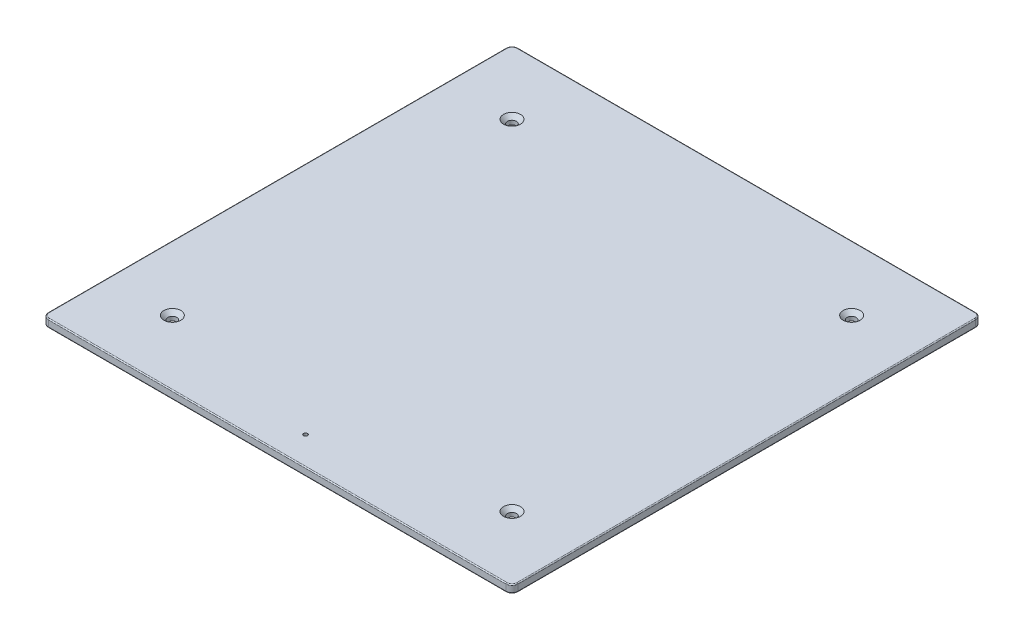
ISO-10303-21;
HEADER;
FILE_DESCRIPTION(('STEP AP214'),'2;1');
FILE_NAME('part.step','',(''),(''),'','','');
FILE_SCHEMA(('AUTOMOTIVE_DESIGN { 1 0 10303 214 1 1 1 1 }'));
ENDSEC;
DATA;
#1=APPLICATION_CONTEXT('core data for automotive mechanical design processes');
#2=APPLICATION_PROTOCOL_DEFINITION('international standard','automotive_design',2000,#1);
#3=PRODUCT_CONTEXT('',#1,'mechanical');
#4=PRODUCT('Part','Part','',(#3));
#5=PRODUCT_RELATED_PRODUCT_CATEGORY('part','',(#4));
#6=PRODUCT_DEFINITION_FORMATION('','',#4);
#7=PRODUCT_DEFINITION_CONTEXT('part definition',#1,'design');
#8=PRODUCT_DEFINITION('design','',#6,#7);
#9=PRODUCT_DEFINITION_SHAPE('','',#8);
#10=(LENGTH_UNIT() NAMED_UNIT(*) SI_UNIT(.MILLI.,.METRE.));
#11=(NAMED_UNIT(*) PLANE_ANGLE_UNIT() SI_UNIT($,.RADIAN.));
#12=(NAMED_UNIT(*) SI_UNIT($,.STERADIAN.) SOLID_ANGLE_UNIT());
#13=UNCERTAINTY_MEASURE_WITH_UNIT(LENGTH_MEASURE(1.E-05),#10,'distance_accuracy_value','');
#14=(GEOMETRIC_REPRESENTATION_CONTEXT(3) GLOBAL_UNCERTAINTY_ASSIGNED_CONTEXT((#13)) GLOBAL_UNIT_ASSIGNED_CONTEXT((#10,
#11,#12)) REPRESENTATION_CONTEXT('',''));
#15=CARTESIAN_POINT('',(0.,0.,0.));
#16=DIRECTION('',(0.,0.,1.));
#17=DIRECTION('',(1.,0.,0.));
#18=AXIS2_PLACEMENT_3D('',#15,#16,#17);
#19=CARTESIAN_POINT('',(0.,4.,0.));
#20=DIRECTION('',(0.,1.,0.));
#21=DIRECTION('',(0.,0.,1.));
#22=AXIS2_PLACEMENT_3D('',#19,#20,#21);
#23=PLANE('',#22);
#24=CARTESIAN_POINT('',(0.,4.,103.332788308511));
#25=DIRECTION('',(0.,1.,0.));
#26=DIRECTION('',(0.,0.,1.));
#27=AXIS2_PLACEMENT_3D('',#24,#25,#26);
#28=CIRCLE('',#27,1.);
#29=CARTESIAN_POINT('',(0.,4.,104.332788308511));
#30=VERTEX_POINT('',#29);
#31=EDGE_CURVE('E886',#30,#30,#28,.T.);
#32=ORIENTED_EDGE('',*,*,#31,.F.);
#33=EDGE_LOOP('',(#32));
#34=FACE_BOUND('',#33,.T.);
#35=DIRECTION('',(-1.,0.,0.));
#36=VECTOR('',#35,1.);
#37=CARTESIAN_POINT('',(-114.5,4.,-117.));
#38=LINE('',#37,#36);
#39=CARTESIAN_POINT('',(114.5,4.,-117.));
#40=VERTEX_POINT('',#39);
#41=CARTESIAN_POINT('',(-114.5,4.,-117.));
#42=VERTEX_POINT('',#41);
#43=EDGE_CURVE('E63',#40,#42,#38,.T.);
#44=ORIENTED_EDGE('',*,*,#43,.T.);
#45=CARTESIAN_POINT('',(-114.5,4.,-114.5));
#46=DIRECTION('',(0.,1.,0.));
#47=DIRECTION('',(0.,0.,1.));
#48=AXIS2_PLACEMENT_3D('',#45,#46,#47);
#49=CIRCLE('',#48,2.5);
#50=CARTESIAN_POINT('',(-117.,4.,-114.5));
#51=VERTEX_POINT('',#50);
#52=EDGE_CURVE('E276',#42,#51,#49,.T.);
#53=ORIENTED_EDGE('',*,*,#52,.T.);
#54=DIRECTION('',(0.,0.,1.));
#55=VECTOR('',#54,1.);
#56=CARTESIAN_POINT('',(-117.,4.,114.5));
#57=LINE('',#56,#55);
#58=CARTESIAN_POINT('',(-117.,4.,114.5));
#59=VERTEX_POINT('',#58);
#60=EDGE_CURVE('E257',#51,#59,#57,.T.);
#61=ORIENTED_EDGE('',*,*,#60,.T.);
#62=CARTESIAN_POINT('',(-114.5,4.,114.5));
#63=DIRECTION('',(0.,1.,0.));
#64=DIRECTION('',(0.,0.,1.));
#65=AXIS2_PLACEMENT_3D('',#62,#63,#64);
#66=CIRCLE('',#65,2.5);
#67=CARTESIAN_POINT('',(-114.5,4.,117.));
#68=VERTEX_POINT('',#67);
#69=EDGE_CURVE('E260',#59,#68,#66,.T.);
#70=ORIENTED_EDGE('',*,*,#69,.T.);
#71=DIRECTION('',(1.,0.,0.));
#72=VECTOR('',#71,1.);
#73=CARTESIAN_POINT('',(114.5,4.,117.));
#74=LINE('',#73,#72);
#75=CARTESIAN_POINT('',(114.5,4.,117.));
#76=VERTEX_POINT('',#75);
#77=EDGE_CURVE('E263',#68,#76,#74,.T.);
#78=ORIENTED_EDGE('',*,*,#77,.T.);
#79=CARTESIAN_POINT('',(114.5,4.,114.5));
#80=DIRECTION('',(0.,1.,0.));
#81=DIRECTION('',(0.,0.,1.));
#82=AXIS2_PLACEMENT_3D('',#79,#80,#81);
#83=CIRCLE('',#82,2.5);
#84=CARTESIAN_POINT('',(117.,4.,114.5));
#85=VERTEX_POINT('',#84);
#86=EDGE_CURVE('E266',#76,#85,#83,.T.);
#87=ORIENTED_EDGE('',*,*,#86,.T.);
#88=DIRECTION('',(0.,0.,-1.));
#89=VECTOR('',#88,1.);
#90=CARTESIAN_POINT('',(117.,4.,-114.5));
#91=LINE('',#90,#89);
#92=CARTESIAN_POINT('',(117.,4.,-114.5));
#93=VERTEX_POINT('',#92);
#94=EDGE_CURVE('E269',#85,#93,#91,.T.);
#95=ORIENTED_EDGE('',*,*,#94,.T.);
#96=CARTESIAN_POINT('',(114.5,4.,-114.5));
#97=DIRECTION('',(0.,1.,0.));
#98=DIRECTION('',(0.,0.,1.));
#99=AXIS2_PLACEMENT_3D('',#96,#97,#98);
#100=CIRCLE('',#99,2.5);
#101=EDGE_CURVE('E68',#93,#40,#100,.T.);
#102=ORIENTED_EDGE('',*,*,#101,.T.);
#103=EDGE_LOOP('',(#44,#53,#61,#70,#78,#87,#95,#102));
#104=FACE_BOUND('',#103,.T.);
#105=CARTESIAN_POINT('',(-85.,4.,85.));
#106=DIRECTION('',(0.,1.,0.));
#107=DIRECTION('',(0.,0.,1.));
#108=AXIS2_PLACEMENT_3D('',#105,#106,#107);
#109=CIRCLE('',#108,4.25);
#110=CARTESIAN_POINT('',(-85.,4.,89.25));
#111=VERTEX_POINT('',#110);
#112=EDGE_CURVE('E842',#111,#111,#109,.F.);
#113=ORIENTED_EDGE('',*,*,#112,.T.);
#114=EDGE_LOOP('',(#113));
#115=FACE_BOUND('',#114,.T.);
#116=CARTESIAN_POINT('',(85.,4.,85.));
#117=DIRECTION('',(0.,1.,0.));
#118=DIRECTION('',(0.,0.,1.));
#119=AXIS2_PLACEMENT_3D('',#116,#117,#118);
#120=CIRCLE('',#119,4.25);
#121=CARTESIAN_POINT('',(85.,4.,89.25));
#122=VERTEX_POINT('',#121);
#123=EDGE_CURVE('E838',#122,#122,#120,.F.);
#124=ORIENTED_EDGE('',*,*,#123,.T.);
#125=EDGE_LOOP('',(#124));
#126=FACE_BOUND('',#125,.T.);
#127=CARTESIAN_POINT('',(85.,4.,-85.));
#128=DIRECTION('',(0.,1.,0.));
#129=DIRECTION('',(0.,0.,1.));
#130=AXIS2_PLACEMENT_3D('',#127,#128,#129);
#131=CIRCLE('',#130,4.24999999999992);
#132=CARTESIAN_POINT('',(85.,4.,-80.75));
#133=VERTEX_POINT('',#132);
#134=EDGE_CURVE('E834',#133,#133,#131,.F.);
#135=ORIENTED_EDGE('',*,*,#134,.T.);
#136=EDGE_LOOP('',(#135));
#137=FACE_BOUND('',#136,.T.);
#138=CARTESIAN_POINT('',(-85.,4.,-85.));
#139=DIRECTION('',(0.,1.,0.));
#140=DIRECTION('',(0.,0.,1.));
#141=AXIS2_PLACEMENT_3D('',#138,#139,#140);
#142=CIRCLE('',#141,4.25000000000009);
#143=CARTESIAN_POINT('',(-85.,4.,-80.7499999999999));
#144=VERTEX_POINT('',#143);
#145=EDGE_CURVE('E824',#144,#144,#142,.F.);
#146=ORIENTED_EDGE('',*,*,#145,.T.);
#147=EDGE_LOOP('',(#146));
#148=FACE_BOUND('',#147,.T.);
#149=ADVANCED_FACE('F45',(#34,#104,#115,#126,#137,#148),#23,.T.);
#150=CARTESIAN_POINT('',(0.,0.,0.));
#151=DIRECTION('',(0.,1.,0.));
#152=DIRECTION('',(0.,0.,1.));
#153=AXIS2_PLACEMENT_3D('',#150,#151,#152);
#154=PLANE('',#153);
#155=CARTESIAN_POINT('',(0.,0.,103.332788308511));
#156=DIRECTION('',(0.,1.,0.));
#157=DIRECTION('',(0.,0.,1.));
#158=AXIS2_PLACEMENT_3D('',#155,#156,#157);
#159=CIRCLE('',#158,1.);
#160=CARTESIAN_POINT('',(0.,0.,104.332788308511));
#161=VERTEX_POINT('',#160);
#162=EDGE_CURVE('E308',#161,#161,#159,.T.);
#163=ORIENTED_EDGE('',*,*,#162,.T.);
#164=EDGE_LOOP('',(#163));
#165=FACE_BOUND('',#164,.T.);
#166=DIRECTION('',(-1.,0.,0.));
#167=VECTOR('',#166,1.);
#168=CARTESIAN_POINT('',(0.,0.,-117.));
#169=LINE('',#168,#167);
#170=CARTESIAN_POINT('',(-114.5,0.,-117.));
#171=VERTEX_POINT('',#170);
#172=CARTESIAN_POINT('',(114.5,0.,-117.));
#173=VERTEX_POINT('',#172);
#174=EDGE_CURVE('E165',#171,#173,#169,.F.);
#175=ORIENTED_EDGE('',*,*,#174,.T.);
#176=CARTESIAN_POINT('',(114.5,0.,-114.5));
#177=DIRECTION('',(0.,1.,0.));
#178=DIRECTION('',(0.,0.,1.));
#179=AXIS2_PLACEMENT_3D('',#176,#177,#178);
#180=CIRCLE('',#179,2.5);
#181=CARTESIAN_POINT('',(117.,0.,-114.5));
#182=VERTEX_POINT('',#181);
#183=EDGE_CURVE('E211',#173,#182,#180,.F.);
#184=ORIENTED_EDGE('',*,*,#183,.T.);
#185=DIRECTION('',(0.,0.,-1.));
#186=VECTOR('',#185,1.);
#187=CARTESIAN_POINT('',(117.,0.,0.));
#188=LINE('',#187,#186);
#189=CARTESIAN_POINT('',(117.,0.,114.5));
#190=VERTEX_POINT('',#189);
#191=EDGE_CURVE('E208',#182,#190,#188,.F.);
#192=ORIENTED_EDGE('',*,*,#191,.T.);
#193=CARTESIAN_POINT('',(114.5,0.,114.5));
#194=DIRECTION('',(0.,1.,0.));
#195=DIRECTION('',(0.,0.,1.));
#196=AXIS2_PLACEMENT_3D('',#193,#194,#195);
#197=CIRCLE('',#196,2.5);
#198=CARTESIAN_POINT('',(114.5,0.,117.));
#199=VERTEX_POINT('',#198);
#200=EDGE_CURVE('E205',#190,#199,#197,.F.);
#201=ORIENTED_EDGE('',*,*,#200,.T.);
#202=DIRECTION('',(1.,0.,0.));
#203=VECTOR('',#202,1.);
#204=CARTESIAN_POINT('',(0.,0.,117.));
#205=LINE('',#204,#203);
#206=CARTESIAN_POINT('',(-114.5,0.,117.));
#207=VERTEX_POINT('',#206);
#208=EDGE_CURVE('E202',#199,#207,#205,.F.);
#209=ORIENTED_EDGE('',*,*,#208,.T.);
#210=CARTESIAN_POINT('',(-114.5,0.,114.5));
#211=DIRECTION('',(0.,1.,0.));
#212=DIRECTION('',(0.,0.,1.));
#213=AXIS2_PLACEMENT_3D('',#210,#211,#212);
#214=CIRCLE('',#213,2.5);
#215=CARTESIAN_POINT('',(-117.,0.,114.5));
#216=VERTEX_POINT('',#215);
#217=EDGE_CURVE('E199',#207,#216,#214,.F.);
#218=ORIENTED_EDGE('',*,*,#217,.T.);
#219=DIRECTION('',(0.,0.,1.));
#220=VECTOR('',#219,1.);
#221=CARTESIAN_POINT('',(-117.,0.,0.));
#222=LINE('',#221,#220);
#223=CARTESIAN_POINT('',(-117.,0.,-114.5));
#224=VERTEX_POINT('',#223);
#225=EDGE_CURVE('E168',#216,#224,#222,.F.);
#226=ORIENTED_EDGE('',*,*,#225,.T.);
#227=CARTESIAN_POINT('',(-114.5,0.,-114.5));
#228=DIRECTION('',(0.,1.,0.));
#229=DIRECTION('',(0.,0.,1.));
#230=AXIS2_PLACEMENT_3D('',#227,#228,#229);
#231=CIRCLE('',#230,2.5);
#232=EDGE_CURVE('E159',#224,#171,#231,.F.);
#233=ORIENTED_EDGE('',*,*,#232,.T.);
#234=EDGE_LOOP('',(#175,#184,#192,#201,#209,#218,#226,#233));
#235=FACE_BOUND('',#234,.T.);
#236=CARTESIAN_POINT('',(85.,0.,-85.));
#237=DIRECTION('',(0.,1.,0.));
#238=DIRECTION('',(0.,0.,1.));
#239=AXIS2_PLACEMENT_3D('',#236,#237,#238);
#240=CIRCLE('',#239,2.25);
#241=CARTESIAN_POINT('',(85.,0.,-82.7499999999999));
#242=VERTEX_POINT('',#241);
#243=EDGE_CURVE('E816',#242,#242,#240,.T.);
#244=ORIENTED_EDGE('',*,*,#243,.T.);
#245=EDGE_LOOP('',(#244));
#246=FACE_BOUND('',#245,.T.);
#247=CARTESIAN_POINT('',(-85.,0.,-85.));
#248=DIRECTION('',(0.,1.,0.));
#249=DIRECTION('',(0.,0.,1.));
#250=AXIS2_PLACEMENT_3D('',#247,#248,#249);
#251=CIRCLE('',#250,2.25);
#252=CARTESIAN_POINT('',(-85.,0.,-82.75));
#253=VERTEX_POINT('',#252);
#254=EDGE_CURVE('E819',#253,#253,#251,.T.);
#255=ORIENTED_EDGE('',*,*,#254,.T.);
#256=EDGE_LOOP('',(#255));
#257=FACE_BOUND('',#256,.T.);
#258=CARTESIAN_POINT('',(-85.,0.,85.));
#259=DIRECTION('',(0.,1.,0.));
#260=DIRECTION('',(0.,0.,1.));
#261=AXIS2_PLACEMENT_3D('',#258,#259,#260);
#262=CIRCLE('',#261,2.25);
#263=CARTESIAN_POINT('',(-85.,0.,87.25));
#264=VERTEX_POINT('',#263);
#265=EDGE_CURVE('E827',#264,#264,#262,.T.);
#266=ORIENTED_EDGE('',*,*,#265,.T.);
#267=EDGE_LOOP('',(#266));
#268=FACE_BOUND('',#267,.T.);
#269=CARTESIAN_POINT('',(85.,0.,85.));
#270=DIRECTION('',(0.,1.,0.));
#271=DIRECTION('',(0.,0.,1.));
#272=AXIS2_PLACEMENT_3D('',#269,#270,#271);
#273=CIRCLE('',#272,2.25);
#274=CARTESIAN_POINT('',(85.,0.,87.25));
#275=VERTEX_POINT('',#274);
#276=EDGE_CURVE('E303',#275,#275,#273,.T.);
#277=ORIENTED_EDGE('',*,*,#276,.T.);
#278=EDGE_LOOP('',(#277));
#279=FACE_BOUND('',#278,.T.);
#280=ADVANCED_FACE('F161',(#165,#235,#246,#257,#268,#279),#154,.F.);
#281=CARTESIAN_POINT('',(117.5,4.,-117.5));
#282=DIRECTION('',(-1.,0.,0.));
#283=DIRECTION('',(0.,0.,1.));
#284=AXIS2_PLACEMENT_3D('',#281,#282,#283);
#285=PLANE('',#284);
#286=DIRECTION('',(0.,-1.,0.));
#287=VECTOR('',#286,1.);
#288=CARTESIAN_POINT('',(117.5,4.,114.5));
#289=LINE('',#288,#287);
#290=CARTESIAN_POINT('',(117.5,3.5,114.5));
#291=VERTEX_POINT('',#290);
#292=CARTESIAN_POINT('',(117.5,0.5,114.5));
#293=VERTEX_POINT('',#292);
#294=EDGE_CURVE('E352',#291,#293,#289,.T.);
#295=ORIENTED_EDGE('',*,*,#294,.T.);
#296=DIRECTION('',(0.,0.,-1.));
#297=VECTOR('',#296,1.);
#298=CARTESIAN_POINT('',(117.5,0.5,-117.5));
#299=LINE('',#298,#297);
#300=CARTESIAN_POINT('',(117.5,0.5,-114.5));
#301=VERTEX_POINT('',#300);
#302=EDGE_CURVE('E224',#293,#301,#299,.T.);
#303=ORIENTED_EDGE('',*,*,#302,.T.);
#304=DIRECTION('',(0.,-1.,0.));
#305=VECTOR('',#304,1.);
#306=CARTESIAN_POINT('',(117.5,4.,-114.5));
#307=LINE('',#306,#305);
#308=CARTESIAN_POINT('',(117.5,3.5,-114.5));
#309=VERTEX_POINT('',#308);
#310=EDGE_CURVE('E856',#301,#309,#307,.F.);
#311=ORIENTED_EDGE('',*,*,#310,.T.);
#312=DIRECTION('',(0.,0.,-1.));
#313=VECTOR('',#312,1.);
#314=CARTESIAN_POINT('',(117.5,3.5,114.5));
#315=LINE('',#314,#313);
#316=EDGE_CURVE('E221',#309,#291,#315,.F.);
#317=ORIENTED_EDGE('',*,*,#316,.T.);
#318=EDGE_LOOP('',(#295,#303,#311,#317));
#319=FACE_BOUND('',#318,.T.);
#320=ADVANCED_FACE('F429',(#319),#285,.F.);
#321=CARTESIAN_POINT('',(-117.5,4.,-117.5));
#322=DIRECTION('',(0.,0.,1.));
#323=DIRECTION('',(1.,0.,0.));
#324=AXIS2_PLACEMENT_3D('',#321,#322,#323);
#325=PLANE('',#324);
#326=DIRECTION('',(0.,-1.,0.));
#327=VECTOR('',#326,1.);
#328=CARTESIAN_POINT('',(-114.5,4.,-117.5));
#329=LINE('',#328,#327);
#330=CARTESIAN_POINT('',(-114.5,0.5,-117.5));
#331=VERTEX_POINT('',#330);
#332=CARTESIAN_POINT('',(-114.5,3.5,-117.5));
#333=VERTEX_POINT('',#332);
#334=EDGE_CURVE('E189',#331,#333,#329,.F.);
#335=ORIENTED_EDGE('',*,*,#334,.T.);
#336=DIRECTION('',(-1.,0.,0.));
#337=VECTOR('',#336,1.);
#338=CARTESIAN_POINT('',(114.5,3.5,-117.5));
#339=LINE('',#338,#337);
#340=CARTESIAN_POINT('',(114.5,3.5,-117.5));
#341=VERTEX_POINT('',#340);
#342=EDGE_CURVE('E11',#333,#341,#339,.F.);
#343=ORIENTED_EDGE('',*,*,#342,.T.);
#344=DIRECTION('',(0.,-1.,0.));
#345=VECTOR('',#344,1.);
#346=CARTESIAN_POINT('',(114.5,4.,-117.5));
#347=LINE('',#346,#345);
#348=CARTESIAN_POINT('',(114.5,0.5,-117.5));
#349=VERTEX_POINT('',#348);
#350=EDGE_CURVE('E193',#341,#349,#347,.T.);
#351=ORIENTED_EDGE('',*,*,#350,.T.);
#352=DIRECTION('',(-1.,0.,0.));
#353=VECTOR('',#352,1.);
#354=CARTESIAN_POINT('',(-117.5,0.5,-117.5));
#355=LINE('',#354,#353);
#356=EDGE_CURVE('E55',#349,#331,#355,.T.);
#357=ORIENTED_EDGE('',*,*,#356,.T.);
#358=EDGE_LOOP('',(#335,#343,#351,#357));
#359=FACE_BOUND('',#358,.T.);
#360=ADVANCED_FACE('F376',(#359),#325,.F.);
#361=CARTESIAN_POINT('',(-117.5,4.,-117.5));
#362=DIRECTION('',(1.,0.,0.));
#363=DIRECTION('',(0.,0.,-1.));
#364=AXIS2_PLACEMENT_3D('',#361,#362,#363);
#365=PLANE('',#364);
#366=DIRECTION('',(0.,-1.,0.));
#367=VECTOR('',#366,1.);
#368=CARTESIAN_POINT('',(-117.5,4.,-114.5));
#369=LINE('',#368,#367);
#370=CARTESIAN_POINT('',(-117.5,3.5,-114.5));
#371=VERTEX_POINT('',#370);
#372=CARTESIAN_POINT('',(-117.5,0.5,-114.5));
#373=VERTEX_POINT('',#372);
#374=EDGE_CURVE('E359',#371,#373,#369,.T.);
#375=ORIENTED_EDGE('',*,*,#374,.T.);
#376=DIRECTION('',(0.,0.,1.));
#377=VECTOR('',#376,1.);
#378=CARTESIAN_POINT('',(-117.5,0.5,-117.5));
#379=LINE('',#378,#377);
#380=CARTESIAN_POINT('',(-117.5,0.5,114.5));
#381=VERTEX_POINT('',#380);
#382=EDGE_CURVE('E248',#373,#381,#379,.T.);
#383=ORIENTED_EDGE('',*,*,#382,.T.);
#384=DIRECTION('',(0.,-1.,0.));
#385=VECTOR('',#384,1.);
#386=CARTESIAN_POINT('',(-117.5,4.,114.5));
#387=LINE('',#386,#385);
#388=CARTESIAN_POINT('',(-117.5,3.5,114.5));
#389=VERTEX_POINT('',#388);
#390=EDGE_CURVE('E365',#381,#389,#387,.F.);
#391=ORIENTED_EDGE('',*,*,#390,.T.);
#392=DIRECTION('',(0.,0.,1.));
#393=VECTOR('',#392,1.);
#394=CARTESIAN_POINT('',(-117.5,3.5,-114.5));
#395=LINE('',#394,#393);
#396=EDGE_CURVE('E245',#389,#371,#395,.F.);
#397=ORIENTED_EDGE('',*,*,#396,.T.);
#398=EDGE_LOOP('',(#375,#383,#391,#397));
#399=FACE_BOUND('',#398,.T.);
#400=ADVANCED_FACE('F407',(#399),#365,.F.);
#401=CARTESIAN_POINT('',(-117.5,4.,117.5));
#402=DIRECTION('',(0.,0.,-1.));
#403=DIRECTION('',(-1.,0.,0.));
#404=AXIS2_PLACEMENT_3D('',#401,#402,#403);
#405=PLANE('',#404);
#406=DIRECTION('',(0.,-1.,0.));
#407=VECTOR('',#406,1.);
#408=CARTESIAN_POINT('',(-114.5,4.,117.5));
#409=LINE('',#408,#407);
#410=CARTESIAN_POINT('',(-114.5,3.5,117.5));
#411=VERTEX_POINT('',#410);
#412=CARTESIAN_POINT('',(-114.5,0.5,117.5));
#413=VERTEX_POINT('',#412);
#414=EDGE_CURVE('E360',#411,#413,#409,.T.);
#415=ORIENTED_EDGE('',*,*,#414,.T.);
#416=DIRECTION('',(1.,0.,0.));
#417=VECTOR('',#416,1.);
#418=CARTESIAN_POINT('',(-117.5,0.5,117.5));
#419=LINE('',#418,#417);
#420=CARTESIAN_POINT('',(114.5,0.5,117.5));
#421=VERTEX_POINT('',#420);
#422=EDGE_CURVE('E236',#413,#421,#419,.T.);
#423=ORIENTED_EDGE('',*,*,#422,.T.);
#424=DIRECTION('',(0.,-1.,0.));
#425=VECTOR('',#424,1.);
#426=CARTESIAN_POINT('',(114.5,4.,117.5));
#427=LINE('',#426,#425);
#428=CARTESIAN_POINT('',(114.5,3.5,117.5));
#429=VERTEX_POINT('',#428);
#430=EDGE_CURVE('E349',#421,#429,#427,.F.);
#431=ORIENTED_EDGE('',*,*,#430,.T.);
#432=DIRECTION('',(1.,0.,0.));
#433=VECTOR('',#432,1.);
#434=CARTESIAN_POINT('',(-114.5,3.5,117.5));
#435=LINE('',#434,#433);
#436=EDGE_CURVE('E233',#429,#411,#435,.F.);
#437=ORIENTED_EDGE('',*,*,#436,.T.);
#438=EDGE_LOOP('',(#415,#423,#431,#437));
#439=FACE_BOUND('',#438,.T.);
#440=ADVANCED_FACE('F355',(#439),#405,.F.);
#441=CARTESIAN_POINT('',(85.,4.,-85.));
#442=DIRECTION('',(0.,-1.,0.));
#443=DIRECTION('',(0.,0.,-1.));
#444=AXIS2_PLACEMENT_3D('',#441,#442,#443);
#445=CYLINDRICAL_SURFACE('',#444,2.25);
#446=CARTESIAN_POINT('',(85.,2.0000000000001,-85.));
#447=DIRECTION('',(0.,1.,0.));
#448=DIRECTION('',(0.,0.,1.));
#449=AXIS2_PLACEMENT_3D('',#446,#447,#448);
#450=CIRCLE('',#449,2.25);
#451=CARTESIAN_POINT('',(85.,2.0000000000001,-82.7499999999999));
#452=VERTEX_POINT('',#451);
#453=EDGE_CURVE('E813',#452,#452,#450,.T.);
#454=ORIENTED_EDGE('',*,*,#453,.T.);
#455=EDGE_LOOP('',(#454));
#456=FACE_BOUND('',#455,.T.);
#457=ORIENTED_EDGE('',*,*,#243,.F.);
#458=EDGE_LOOP('',(#457));
#459=FACE_BOUND('',#458,.T.);
#460=ADVANCED_FACE('F434',(#456,#459),#445,.F.);
#461=CARTESIAN_POINT('',(-85.,4.,-85.));
#462=DIRECTION('',(0.,-1.,0.));
#463=DIRECTION('',(0.,0.,-1.));
#464=AXIS2_PLACEMENT_3D('',#461,#462,#463);
#465=CYLINDRICAL_SURFACE('',#464,2.25);
#466=CARTESIAN_POINT('',(-85.,1.99999999999993,-85.));
#467=DIRECTION('',(0.,1.,0.));
#468=DIRECTION('',(0.,0.,1.));
#469=AXIS2_PLACEMENT_3D('',#466,#467,#468);
#470=CIRCLE('',#469,2.25);
#471=CARTESIAN_POINT('',(-85.,1.99999999999993,-82.75));
#472=VERTEX_POINT('',#471);
#473=EDGE_CURVE('E852',#472,#472,#470,.T.);
#474=ORIENTED_EDGE('',*,*,#473,.T.);
#475=EDGE_LOOP('',(#474));
#476=FACE_BOUND('',#475,.T.);
#477=ORIENTED_EDGE('',*,*,#254,.F.);
#478=EDGE_LOOP('',(#477));
#479=FACE_BOUND('',#478,.T.);
#480=ADVANCED_FACE('F742',(#476,#479),#465,.F.);
#481=CARTESIAN_POINT('',(-85.,4.,85.));
#482=DIRECTION('',(0.,-1.,0.));
#483=DIRECTION('',(0.,0.,-1.));
#484=AXIS2_PLACEMENT_3D('',#481,#482,#483);
#485=CYLINDRICAL_SURFACE('',#484,2.25);
#486=CARTESIAN_POINT('',(-85.,2.00000000000001,85.));
#487=DIRECTION('',(0.,1.,0.));
#488=DIRECTION('',(0.,0.,1.));
#489=AXIS2_PLACEMENT_3D('',#486,#487,#488);
#490=CIRCLE('',#489,2.25);
#491=CARTESIAN_POINT('',(-85.,2.00000000000001,87.25));
#492=VERTEX_POINT('',#491);
#493=EDGE_CURVE('E818',#492,#492,#490,.T.);
#494=ORIENTED_EDGE('',*,*,#493,.T.);
#495=EDGE_LOOP('',(#494));
#496=FACE_BOUND('',#495,.T.);
#497=ORIENTED_EDGE('',*,*,#265,.F.);
#498=EDGE_LOOP('',(#497));
#499=FACE_BOUND('',#498,.T.);
#500=ADVANCED_FACE('F732',(#496,#499),#485,.F.);
#501=CARTESIAN_POINT('',(85.,4.,85.));
#502=DIRECTION('',(0.,-1.,0.));
#503=DIRECTION('',(0.,0.,-1.));
#504=AXIS2_PLACEMENT_3D('',#501,#502,#503);
#505=CYLINDRICAL_SURFACE('',#504,2.25);
#506=CARTESIAN_POINT('',(85.,2.00000000000001,85.));
#507=DIRECTION('',(0.,1.,0.));
#508=DIRECTION('',(0.,0.,1.));
#509=AXIS2_PLACEMENT_3D('',#506,#507,#508);
#510=CIRCLE('',#509,2.25);
#511=CARTESIAN_POINT('',(85.,2.00000000000001,87.25));
#512=VERTEX_POINT('',#511);
#513=EDGE_CURVE('E846',#512,#512,#510,.T.);
#514=ORIENTED_EDGE('',*,*,#513,.T.);
#515=EDGE_LOOP('',(#514));
#516=FACE_BOUND('',#515,.T.);
#517=ORIENTED_EDGE('',*,*,#276,.F.);
#518=EDGE_LOOP('',(#517));
#519=FACE_BOUND('',#518,.T.);
#520=ADVANCED_FACE('F454',(#516,#519),#505,.F.);
#521=CARTESIAN_POINT('',(-85.,2.00000000000001,85.));
#522=DIRECTION('',(0.,1.,0.));
#523=DIRECTION('',(0.,0.,1.));
#524=AXIS2_PLACEMENT_3D('',#521,#522,#523);
#525=CONICAL_SURFACE('',#524,2.25,0.785398163397453);
#526=ORIENTED_EDGE('',*,*,#112,.F.);
#527=EDGE_LOOP('',(#526));
#528=FACE_BOUND('',#527,.T.);
#529=ORIENTED_EDGE('',*,*,#493,.F.);
#530=EDGE_LOOP('',(#529));
#531=FACE_BOUND('',#530,.T.);
#532=ADVANCED_FACE('F447',(#528,#531),#525,.F.);
#533=CARTESIAN_POINT('',(85.,2.00000000000001,85.));
#534=DIRECTION('',(0.,1.,0.));
#535=DIRECTION('',(0.,0.,1.));
#536=AXIS2_PLACEMENT_3D('',#533,#534,#535);
#537=CONICAL_SURFACE('',#536,2.25,0.785398163397453);
#538=ORIENTED_EDGE('',*,*,#123,.F.);
#539=EDGE_LOOP('',(#538));
#540=FACE_BOUND('',#539,.T.);
#541=ORIENTED_EDGE('',*,*,#513,.F.);
#542=EDGE_LOOP('',(#541));
#543=FACE_BOUND('',#542,.T.);
#544=ADVANCED_FACE('F453',(#540,#543),#537,.F.);
#545=CARTESIAN_POINT('',(85.,2.0000000000001,-85.));
#546=DIRECTION('',(0.,1.,0.));
#547=DIRECTION('',(0.,0.,1.));
#548=AXIS2_PLACEMENT_3D('',#545,#546,#547);
#549=CONICAL_SURFACE('',#548,2.25,0.785398163397453);
#550=ORIENTED_EDGE('',*,*,#134,.F.);
#551=EDGE_LOOP('',(#550));
#552=FACE_BOUND('',#551,.T.);
#553=ORIENTED_EDGE('',*,*,#453,.F.);
#554=EDGE_LOOP('',(#553));
#555=FACE_BOUND('',#554,.T.);
#556=ADVANCED_FACE('F461',(#552,#555),#549,.F.);
#557=CARTESIAN_POINT('',(-85.,1.99999999999993,-85.));
#558=DIRECTION('',(0.,1.,0.));
#559=DIRECTION('',(0.,0.,1.));
#560=AXIS2_PLACEMENT_3D('',#557,#558,#559);
#561=CONICAL_SURFACE('',#560,2.25,0.785398163397453);
#562=ORIENTED_EDGE('',*,*,#145,.F.);
#563=EDGE_LOOP('',(#562));
#564=FACE_BOUND('',#563,.T.);
#565=ORIENTED_EDGE('',*,*,#473,.F.);
#566=EDGE_LOOP('',(#565));
#567=FACE_BOUND('',#566,.T.);
#568=ADVANCED_FACE('F468',(#564,#567),#561,.F.);
#569=CARTESIAN_POINT('',(114.5,4.,114.5));
#570=DIRECTION('',(0.,-1.,0.));
#571=DIRECTION('',(0.,0.,-1.));
#572=AXIS2_PLACEMENT_3D('',#569,#570,#571);
#573=CYLINDRICAL_SURFACE('',#572,3.);
#574=ORIENTED_EDGE('',*,*,#430,.F.);
#575=CARTESIAN_POINT('',(114.5,0.5,114.5));
#576=DIRECTION('',(0.,1.,0.));
#577=DIRECTION('',(0.,0.,1.));
#578=AXIS2_PLACEMENT_3D('',#575,#576,#577);
#579=CIRCLE('',#578,3.);
#580=EDGE_CURVE('E230',#421,#293,#579,.T.);
#581=ORIENTED_EDGE('',*,*,#580,.T.);
#582=ORIENTED_EDGE('',*,*,#294,.F.);
#583=CARTESIAN_POINT('',(114.5,3.5,114.5));
#584=DIRECTION('',(0.,1.,0.));
#585=DIRECTION('',(0.,0.,1.));
#586=AXIS2_PLACEMENT_3D('',#583,#584,#585);
#587=CIRCLE('',#586,3.);
#588=EDGE_CURVE('E227',#291,#429,#587,.F.);
#589=ORIENTED_EDGE('',*,*,#588,.T.);
#590=EDGE_LOOP('',(#574,#581,#582,#589));
#591=FACE_BOUND('',#590,.T.);
#592=ADVANCED_FACE('F348',(#591),#573,.T.);
#593=CARTESIAN_POINT('',(-114.5,4.,114.5));
#594=DIRECTION('',(0.,-1.,0.));
#595=DIRECTION('',(0.,0.,-1.));
#596=AXIS2_PLACEMENT_3D('',#593,#594,#595);
#597=CYLINDRICAL_SURFACE('',#596,3.);
#598=ORIENTED_EDGE('',*,*,#390,.F.);
#599=CARTESIAN_POINT('',(-114.5,0.5,114.5));
#600=DIRECTION('',(0.,1.,0.));
#601=DIRECTION('',(0.,0.,1.));
#602=AXIS2_PLACEMENT_3D('',#599,#600,#601);
#603=CIRCLE('',#602,3.);
#604=EDGE_CURVE('E242',#381,#413,#603,.T.);
#605=ORIENTED_EDGE('',*,*,#604,.T.);
#606=ORIENTED_EDGE('',*,*,#414,.F.);
#607=CARTESIAN_POINT('',(-114.5,3.5,114.5));
#608=DIRECTION('',(0.,1.,0.));
#609=DIRECTION('',(0.,0.,1.));
#610=AXIS2_PLACEMENT_3D('',#607,#608,#609);
#611=CIRCLE('',#610,3.);
#612=EDGE_CURVE('E239',#411,#389,#611,.F.);
#613=ORIENTED_EDGE('',*,*,#612,.T.);
#614=EDGE_LOOP('',(#598,#605,#606,#613));
#615=FACE_BOUND('',#614,.T.);
#616=ADVANCED_FACE('F413',(#615),#597,.T.);
#617=CARTESIAN_POINT('',(-114.5,4.,-114.5));
#618=DIRECTION('',(0.,-1.,0.));
#619=DIRECTION('',(0.,0.,-1.));
#620=AXIS2_PLACEMENT_3D('',#617,#618,#619);
#621=CYLINDRICAL_SURFACE('',#620,3.);
#622=ORIENTED_EDGE('',*,*,#334,.F.);
#623=CARTESIAN_POINT('',(-114.5,0.5,-114.5));
#624=DIRECTION('',(0.,1.,0.));
#625=DIRECTION('',(0.,0.,1.));
#626=AXIS2_PLACEMENT_3D('',#623,#624,#625);
#627=CIRCLE('',#626,3.);
#628=EDGE_CURVE('E178',#331,#373,#627,.T.);
#629=ORIENTED_EDGE('',*,*,#628,.T.);
#630=ORIENTED_EDGE('',*,*,#374,.F.);
#631=CARTESIAN_POINT('',(-114.5,3.5,-114.5));
#632=DIRECTION('',(0.,1.,0.));
#633=DIRECTION('',(0.,0.,1.));
#634=AXIS2_PLACEMENT_3D('',#631,#632,#633);
#635=CIRCLE('',#634,3.);
#636=EDGE_CURVE('E251',#371,#333,#635,.F.);
#637=ORIENTED_EDGE('',*,*,#636,.T.);
#638=EDGE_LOOP('',(#622,#629,#630,#637));
#639=FACE_BOUND('',#638,.T.);
#640=ADVANCED_FACE('F411',(#639),#621,.T.);
#641=CARTESIAN_POINT('',(114.5,4.,-114.5));
#642=DIRECTION('',(0.,-1.,0.));
#643=DIRECTION('',(0.,0.,-1.));
#644=AXIS2_PLACEMENT_3D('',#641,#642,#643);
#645=CYLINDRICAL_SURFACE('',#644,3.);
#646=ORIENTED_EDGE('',*,*,#310,.F.);
#647=CARTESIAN_POINT('',(114.5,0.5,-114.5));
#648=DIRECTION('',(0.,1.,0.));
#649=DIRECTION('',(0.,0.,1.));
#650=AXIS2_PLACEMENT_3D('',#647,#648,#649);
#651=CIRCLE('',#650,3.);
#652=EDGE_CURVE('E217',#301,#349,#651,.T.);
#653=ORIENTED_EDGE('',*,*,#652,.T.);
#654=ORIENTED_EDGE('',*,*,#350,.F.);
#655=CARTESIAN_POINT('',(114.5,3.5,-114.5));
#656=DIRECTION('',(0.,1.,0.));
#657=DIRECTION('',(0.,0.,1.));
#658=AXIS2_PLACEMENT_3D('',#655,#656,#657);
#659=CIRCLE('',#658,3.);
#660=EDGE_CURVE('E214',#341,#309,#659,.F.);
#661=ORIENTED_EDGE('',*,*,#660,.T.);
#662=EDGE_LOOP('',(#646,#653,#654,#661));
#663=FACE_BOUND('',#662,.T.);
#664=ADVANCED_FACE('F382',(#663),#645,.T.);
#665=CARTESIAN_POINT('',(-114.5,0.5,114.5));
#666=DIRECTION('',(0.,1.,0.));
#667=DIRECTION('',(0.,0.,1.));
#668=AXIS2_PLACEMENT_3D('',#665,#666,#667);
#669=TOROIDAL_SURFACE('',#668,2.5,0.5);
#670=CARTESIAN_POINT('',(-114.5,0.5,117.));
#671=DIRECTION('',(1.,0.,0.));
#672=DIRECTION('',(0.,0.,-1.));
#673=AXIS2_PLACEMENT_3D('',#670,#671,#672);
#674=CIRCLE('',#673,0.5);
#675=EDGE_CURVE('E295',#413,#207,#674,.T.);
#676=ORIENTED_EDGE('',*,*,#675,.F.);
#677=ORIENTED_EDGE('',*,*,#604,.F.);
#678=CARTESIAN_POINT('',(-117.,0.5,114.5));
#679=DIRECTION('',(0.,0.,-1.));
#680=DIRECTION('',(-1.,0.,0.));
#681=AXIS2_PLACEMENT_3D('',#678,#679,#680);
#682=CIRCLE('',#681,0.5);
#683=EDGE_CURVE('E299',#216,#381,#682,.T.);
#684=ORIENTED_EDGE('',*,*,#683,.F.);
#685=ORIENTED_EDGE('',*,*,#217,.F.);
#686=EDGE_LOOP('',(#676,#677,#684,#685));
#687=FACE_BOUND('',#686,.T.);
#688=ADVANCED_FACE('F419',(#687),#669,.T.);
#689=CARTESIAN_POINT('',(-117.,0.5,-117.5));
#690=DIRECTION('',(0.,0.,1.));
#691=DIRECTION('',(1.,0.,0.));
#692=AXIS2_PLACEMENT_3D('',#689,#690,#691);
#693=CYLINDRICAL_SURFACE('',#692,0.5);
#694=ORIENTED_EDGE('',*,*,#683,.T.);
#695=ORIENTED_EDGE('',*,*,#382,.F.);
#696=CARTESIAN_POINT('',(-117.,0.5,-114.5));
#697=DIRECTION('',(0.,0.,-1.));
#698=DIRECTION('',(-1.,0.,0.));
#699=AXIS2_PLACEMENT_3D('',#696,#697,#698);
#700=CIRCLE('',#699,0.5);
#701=EDGE_CURVE('E292',#224,#373,#700,.T.);
#702=ORIENTED_EDGE('',*,*,#701,.F.);
#703=ORIENTED_EDGE('',*,*,#225,.F.);
#704=EDGE_LOOP('',(#694,#695,#702,#703));
#705=FACE_BOUND('',#704,.T.);
#706=ADVANCED_FACE('F507',(#705),#693,.T.);
#707=CARTESIAN_POINT('',(-117.5,0.5,117.));
#708=DIRECTION('',(1.,0.,0.));
#709=DIRECTION('',(0.,0.,-1.));
#710=AXIS2_PLACEMENT_3D('',#707,#708,#709);
#711=CYLINDRICAL_SURFACE('',#710,0.5);
#712=ORIENTED_EDGE('',*,*,#675,.T.);
#713=ORIENTED_EDGE('',*,*,#208,.F.);
#714=CARTESIAN_POINT('',(114.5,0.5,117.));
#715=DIRECTION('',(1.,0.,0.));
#716=DIRECTION('',(0.,0.,-1.));
#717=AXIS2_PLACEMENT_3D('',#714,#715,#716);
#718=CIRCLE('',#717,0.5);
#719=EDGE_CURVE('E182',#421,#199,#718,.T.);
#720=ORIENTED_EDGE('',*,*,#719,.F.);
#721=ORIENTED_EDGE('',*,*,#422,.F.);
#722=EDGE_LOOP('',(#712,#713,#720,#721));
#723=FACE_BOUND('',#722,.T.);
#724=ADVANCED_FACE('F518',(#723),#711,.T.);
#725=CARTESIAN_POINT('',(-114.5,0.5,-114.5));
#726=DIRECTION('',(0.,1.,0.));
#727=DIRECTION('',(0.,0.,1.));
#728=AXIS2_PLACEMENT_3D('',#725,#726,#727);
#729=TOROIDAL_SURFACE('',#728,2.5,0.5);
#730=ORIENTED_EDGE('',*,*,#701,.T.);
#731=ORIENTED_EDGE('',*,*,#628,.F.);
#732=CARTESIAN_POINT('',(-114.5,0.5,-117.));
#733=DIRECTION('',(1.,0.,0.));
#734=DIRECTION('',(0.,0.,-1.));
#735=AXIS2_PLACEMENT_3D('',#732,#733,#734);
#736=CIRCLE('',#735,0.5);
#737=EDGE_CURVE('E176',#171,#331,#736,.T.);
#738=ORIENTED_EDGE('',*,*,#737,.F.);
#739=ORIENTED_EDGE('',*,*,#232,.F.);
#740=EDGE_LOOP('',(#730,#731,#738,#739));
#741=FACE_BOUND('',#740,.T.);
#742=ADVANCED_FACE('F177',(#741),#729,.T.);
#743=CARTESIAN_POINT('',(114.5,0.5,114.5));
#744=DIRECTION('',(0.,1.,0.));
#745=DIRECTION('',(0.,0.,1.));
#746=AXIS2_PLACEMENT_3D('',#743,#744,#745);
#747=TOROIDAL_SURFACE('',#746,2.5,0.5);
#748=ORIENTED_EDGE('',*,*,#719,.T.);
#749=ORIENTED_EDGE('',*,*,#200,.F.);
#750=CARTESIAN_POINT('',(117.,0.5,114.5));
#751=DIRECTION('',(0.,0.,-1.));
#752=DIRECTION('',(-1.,0.,0.));
#753=AXIS2_PLACEMENT_3D('',#750,#751,#752);
#754=CIRCLE('',#753,0.5);
#755=EDGE_CURVE('E183',#293,#190,#754,.T.);
#756=ORIENTED_EDGE('',*,*,#755,.F.);
#757=ORIENTED_EDGE('',*,*,#580,.F.);
#758=EDGE_LOOP('',(#748,#749,#756,#757));
#759=FACE_BOUND('',#758,.T.);
#760=ADVANCED_FACE('F539',(#759),#747,.T.);
#761=CARTESIAN_POINT('',(-117.5,0.5,-117.));
#762=DIRECTION('',(-1.,0.,0.));
#763=DIRECTION('',(0.,0.,1.));
#764=AXIS2_PLACEMENT_3D('',#761,#762,#763);
#765=CYLINDRICAL_SURFACE('',#764,0.5);
#766=ORIENTED_EDGE('',*,*,#737,.T.);
#767=ORIENTED_EDGE('',*,*,#356,.F.);
#768=CARTESIAN_POINT('',(114.5,0.5,-117.));
#769=DIRECTION('',(1.,0.,0.));
#770=DIRECTION('',(0.,0.,-1.));
#771=AXIS2_PLACEMENT_3D('',#768,#769,#770);
#772=CIRCLE('',#771,0.5);
#773=EDGE_CURVE('E186',#173,#349,#772,.T.);
#774=ORIENTED_EDGE('',*,*,#773,.F.);
#775=ORIENTED_EDGE('',*,*,#174,.F.);
#776=EDGE_LOOP('',(#766,#767,#774,#775));
#777=FACE_BOUND('',#776,.T.);
#778=ADVANCED_FACE('F185',(#777),#765,.T.);
#779=CARTESIAN_POINT('',(117.,0.5,-117.5));
#780=DIRECTION('',(0.,0.,-1.));
#781=DIRECTION('',(-1.,0.,0.));
#782=AXIS2_PLACEMENT_3D('',#779,#780,#781);
#783=CYLINDRICAL_SURFACE('',#782,0.5);
#784=ORIENTED_EDGE('',*,*,#755,.T.);
#785=ORIENTED_EDGE('',*,*,#191,.F.);
#786=CARTESIAN_POINT('',(117.,0.5,-114.5));
#787=DIRECTION('',(0.,0.,-1.));
#788=DIRECTION('',(-1.,0.,0.));
#789=AXIS2_PLACEMENT_3D('',#786,#787,#788);
#790=CIRCLE('',#789,0.5);
#791=EDGE_CURVE('E281',#301,#182,#790,.T.);
#792=ORIENTED_EDGE('',*,*,#791,.F.);
#793=ORIENTED_EDGE('',*,*,#302,.F.);
#794=EDGE_LOOP('',(#784,#785,#792,#793));
#795=FACE_BOUND('',#794,.T.);
#796=ADVANCED_FACE('F559',(#795),#783,.T.);
#797=CARTESIAN_POINT('',(114.5,0.5,-114.5));
#798=DIRECTION('',(0.,1.,0.));
#799=DIRECTION('',(0.,0.,1.));
#800=AXIS2_PLACEMENT_3D('',#797,#798,#799);
#801=TOROIDAL_SURFACE('',#800,2.5,0.5);
#802=ORIENTED_EDGE('',*,*,#773,.T.);
#803=ORIENTED_EDGE('',*,*,#652,.F.);
#804=ORIENTED_EDGE('',*,*,#791,.T.);
#805=ORIENTED_EDGE('',*,*,#183,.F.);
#806=EDGE_LOOP('',(#802,#803,#804,#805));
#807=FACE_BOUND('',#806,.T.);
#808=ADVANCED_FACE('F569',(#807),#801,.T.);
#809=CARTESIAN_POINT('',(114.5,3.5,114.5));
#810=DIRECTION('',(0.,1.,0.));
#811=DIRECTION('',(0.,0.,1.));
#812=AXIS2_PLACEMENT_3D('',#809,#810,#811);
#813=TOROIDAL_SURFACE('',#812,2.5,0.5);
#814=CARTESIAN_POINT('',(114.5,3.5,117.));
#815=DIRECTION('',(-1.,0.,0.));
#816=DIRECTION('',(0.,0.,1.));
#817=AXIS2_PLACEMENT_3D('',#814,#815,#816);
#818=CIRCLE('',#817,0.5);
#819=EDGE_CURVE('E326',#429,#76,#818,.T.);
#820=ORIENTED_EDGE('',*,*,#819,.F.);
#821=ORIENTED_EDGE('',*,*,#588,.F.);
#822=CARTESIAN_POINT('',(117.,3.5,114.5));
#823=DIRECTION('',(0.,0.,-1.));
#824=DIRECTION('',(-1.,0.,0.));
#825=AXIS2_PLACEMENT_3D('',#822,#823,#824);
#826=CIRCLE('',#825,0.5);
#827=EDGE_CURVE('E49',#85,#291,#826,.T.);
#828=ORIENTED_EDGE('',*,*,#827,.F.);
#829=ORIENTED_EDGE('',*,*,#86,.F.);
#830=EDGE_LOOP('',(#820,#821,#828,#829));
#831=FACE_BOUND('',#830,.T.);
#832=ADVANCED_FACE('F47',(#831),#813,.T.);
#833=CARTESIAN_POINT('',(117.,3.5,0.));
#834=DIRECTION('',(0.,0.,1.));
#835=DIRECTION('',(1.,0.,0.));
#836=AXIS2_PLACEMENT_3D('',#833,#834,#835);
#837=CYLINDRICAL_SURFACE('',#836,0.5);
#838=ORIENTED_EDGE('',*,*,#827,.T.);
#839=ORIENTED_EDGE('',*,*,#316,.F.);
#840=CARTESIAN_POINT('',(117.,3.5,-114.5));
#841=DIRECTION('',(0.,0.,-1.));
#842=DIRECTION('',(-1.,0.,0.));
#843=AXIS2_PLACEMENT_3D('',#840,#841,#842);
#844=CIRCLE('',#843,0.5);
#845=EDGE_CURVE('E323',#93,#309,#844,.T.);
#846=ORIENTED_EDGE('',*,*,#845,.F.);
#847=ORIENTED_EDGE('',*,*,#94,.F.);
#848=EDGE_LOOP('',(#838,#839,#846,#847));
#849=FACE_BOUND('',#848,.T.);
#850=ADVANCED_FACE('F339',(#849),#837,.T.);
#851=CARTESIAN_POINT('',(0.,3.5,117.));
#852=DIRECTION('',(-1.,0.,0.));
#853=DIRECTION('',(0.,0.,1.));
#854=AXIS2_PLACEMENT_3D('',#851,#852,#853);
#855=CYLINDRICAL_SURFACE('',#854,0.5);
#856=ORIENTED_EDGE('',*,*,#819,.T.);
#857=ORIENTED_EDGE('',*,*,#77,.F.);
#858=CARTESIAN_POINT('',(-114.5,3.5,117.));
#859=DIRECTION('',(-1.,0.,0.));
#860=DIRECTION('',(0.,0.,1.));
#861=AXIS2_PLACEMENT_3D('',#858,#859,#860);
#862=CIRCLE('',#861,0.5);
#863=EDGE_CURVE('E319',#411,#68,#862,.T.);
#864=ORIENTED_EDGE('',*,*,#863,.F.);
#865=ORIENTED_EDGE('',*,*,#436,.F.);
#866=EDGE_LOOP('',(#856,#857,#864,#865));
#867=FACE_BOUND('',#866,.T.);
#868=ADVANCED_FACE('F598',(#867),#855,.T.);
#869=CARTESIAN_POINT('',(114.5,3.5,-114.5));
#870=DIRECTION('',(0.,1.,0.));
#871=DIRECTION('',(0.,0.,1.));
#872=AXIS2_PLACEMENT_3D('',#869,#870,#871);
#873=TOROIDAL_SURFACE('',#872,2.5,0.5);
#874=ORIENTED_EDGE('',*,*,#845,.T.);
#875=ORIENTED_EDGE('',*,*,#660,.F.);
#876=CARTESIAN_POINT('',(114.5,3.5,-117.));
#877=DIRECTION('',(-1.,0.,0.));
#878=DIRECTION('',(0.,0.,1.));
#879=AXIS2_PLACEMENT_3D('',#876,#877,#878);
#880=CIRCLE('',#879,0.5);
#881=EDGE_CURVE('E315',#40,#341,#880,.T.);
#882=ORIENTED_EDGE('',*,*,#881,.F.);
#883=ORIENTED_EDGE('',*,*,#101,.F.);
#884=EDGE_LOOP('',(#874,#875,#882,#883));
#885=FACE_BOUND('',#884,.T.);
#886=ADVANCED_FACE('F386',(#885),#873,.T.);
#887=CARTESIAN_POINT('',(-114.5,3.5,114.5));
#888=DIRECTION('',(0.,1.,0.));
#889=DIRECTION('',(0.,0.,1.));
#890=AXIS2_PLACEMENT_3D('',#887,#888,#889);
#891=TOROIDAL_SURFACE('',#890,2.5,0.5);
#892=ORIENTED_EDGE('',*,*,#863,.T.);
#893=ORIENTED_EDGE('',*,*,#69,.F.);
#894=CARTESIAN_POINT('',(-117.,3.5,114.5));
#895=DIRECTION('',(0.,0.,-1.));
#896=DIRECTION('',(-1.,0.,0.));
#897=AXIS2_PLACEMENT_3D('',#894,#895,#896);
#898=CIRCLE('',#897,0.5);
#899=EDGE_CURVE('E311',#389,#59,#898,.T.);
#900=ORIENTED_EDGE('',*,*,#899,.F.);
#901=ORIENTED_EDGE('',*,*,#612,.F.);
#902=EDGE_LOOP('',(#892,#893,#900,#901));
#903=FACE_BOUND('',#902,.T.);
#904=ADVANCED_FACE('F400',(#903),#891,.T.);
#905=CARTESIAN_POINT('',(0.,3.5,-117.));
#906=DIRECTION('',(1.,0.,0.));
#907=DIRECTION('',(0.,0.,-1.));
#908=AXIS2_PLACEMENT_3D('',#905,#906,#907);
#909=CYLINDRICAL_SURFACE('',#908,0.5);
#910=ORIENTED_EDGE('',*,*,#881,.T.);
#911=ORIENTED_EDGE('',*,*,#342,.F.);
#912=CARTESIAN_POINT('',(-114.5,3.5,-117.));
#913=DIRECTION('',(-1.,0.,0.));
#914=DIRECTION('',(0.,0.,1.));
#915=AXIS2_PLACEMENT_3D('',#912,#913,#914);
#916=CIRCLE('',#915,0.5);
#917=EDGE_CURVE('E307',#42,#333,#916,.T.);
#918=ORIENTED_EDGE('',*,*,#917,.F.);
#919=ORIENTED_EDGE('',*,*,#43,.F.);
#920=EDGE_LOOP('',(#910,#911,#918,#919));
#921=FACE_BOUND('',#920,.T.);
#922=ADVANCED_FACE('F388',(#921),#909,.T.);
#923=CARTESIAN_POINT('',(-117.,3.5,0.));
#924=DIRECTION('',(0.,0.,-1.));
#925=DIRECTION('',(-1.,0.,0.));
#926=AXIS2_PLACEMENT_3D('',#923,#924,#925);
#927=CYLINDRICAL_SURFACE('',#926,0.5);
#928=ORIENTED_EDGE('',*,*,#899,.T.);
#929=ORIENTED_EDGE('',*,*,#60,.F.);
#930=CARTESIAN_POINT('',(-117.,3.5,-114.5));
#931=DIRECTION('',(0.,0.,-1.));
#932=DIRECTION('',(-1.,0.,0.));
#933=AXIS2_PLACEMENT_3D('',#930,#931,#932);
#934=CIRCLE('',#933,0.5);
#935=EDGE_CURVE('E304',#371,#51,#934,.T.);
#936=ORIENTED_EDGE('',*,*,#935,.F.);
#937=ORIENTED_EDGE('',*,*,#396,.F.);
#938=EDGE_LOOP('',(#928,#929,#936,#937));
#939=FACE_BOUND('',#938,.T.);
#940=ADVANCED_FACE('F404',(#939),#927,.T.);
#941=CARTESIAN_POINT('',(-114.5,3.5,-114.5));
#942=DIRECTION('',(0.,1.,0.));
#943=DIRECTION('',(0.,0.,1.));
#944=AXIS2_PLACEMENT_3D('',#941,#942,#943);
#945=TOROIDAL_SURFACE('',#944,2.5,0.5);
#946=ORIENTED_EDGE('',*,*,#917,.T.);
#947=ORIENTED_EDGE('',*,*,#636,.F.);
#948=ORIENTED_EDGE('',*,*,#935,.T.);
#949=ORIENTED_EDGE('',*,*,#52,.F.);
#950=EDGE_LOOP('',(#946,#947,#948,#949));
#951=FACE_BOUND('',#950,.T.);
#952=ADVANCED_FACE('F392',(#951),#945,.T.);
#953=CARTESIAN_POINT('',(0.,0.,103.332788308511));
#954=DIRECTION('',(0.,1.,0.));
#955=DIRECTION('',(0.,0.,1.));
#956=AXIS2_PLACEMENT_3D('',#953,#954,#955);
#957=CYLINDRICAL_SURFACE('',#956,1.);
#958=ORIENTED_EDGE('',*,*,#162,.F.);
#959=EDGE_LOOP('',(#958));
#960=FACE_BOUND('',#959,.T.);
#961=ORIENTED_EDGE('',*,*,#31,.T.);
#962=EDGE_LOOP('',(#961));
#963=FACE_BOUND('',#962,.T.);
#964=ADVANCED_FACE('F651',(#960,#963),#957,.F.);
#965=CLOSED_SHELL('',(#149,#280,#320,#360,#400,#440,#460,#480,#500,#520,#532,#544,#556,#568,
#592,#616,#640,#664,#688,#706,#724,#742,#760,#778,#796,#808,#832,#850,#868,#886,#904,#922,#940,
#952,#964));
#966=MANIFOLD_SOLID_BREP('B2',#965);
#967=ADVANCED_BREP_SHAPE_REPRESENTATION('',(#18,#966),#14);
#968=SHAPE_DEFINITION_REPRESENTATION(#9,#967);
ENDSEC;
END-ISO-10303-21;
